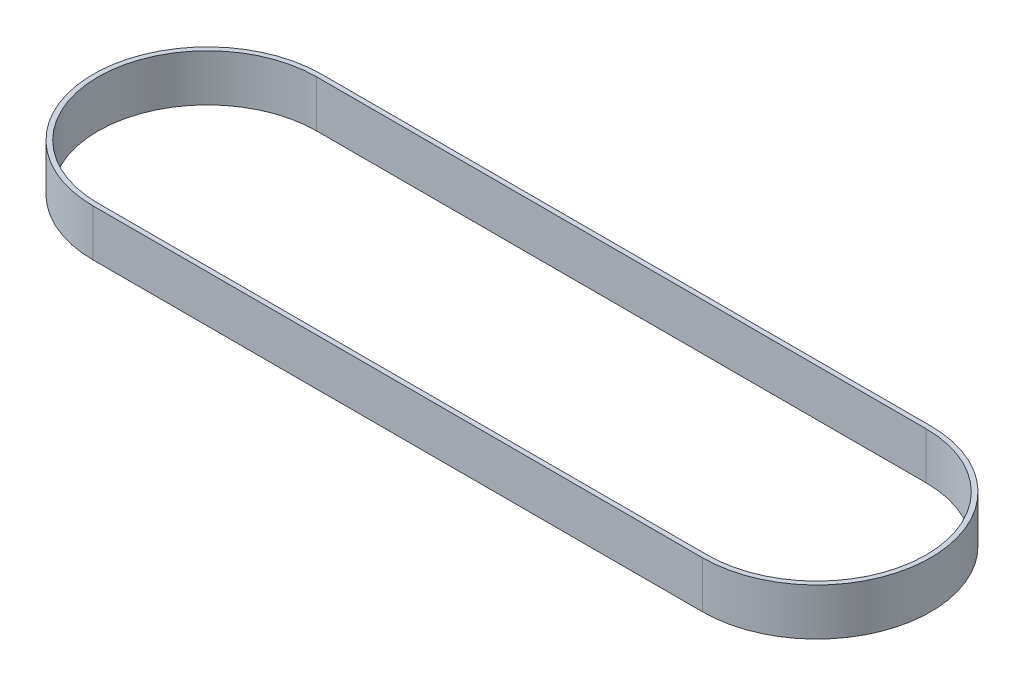
ISO-10303-21;
HEADER;
FILE_DESCRIPTION(('STEP AP214'),'2;1');
FILE_NAME('part.step','',(''),(''),'','','');
FILE_SCHEMA(('AUTOMOTIVE_DESIGN { 1 0 10303 214 1 1 1 1 }'));
ENDSEC;
DATA;
#1=APPLICATION_CONTEXT('core data for automotive mechanical design processes');
#2=APPLICATION_PROTOCOL_DEFINITION('international standard','automotive_design',2000,#1);
#3=PRODUCT_CONTEXT('',#1,'mechanical');
#4=PRODUCT('Part','Part','',(#3));
#5=PRODUCT_RELATED_PRODUCT_CATEGORY('part','',(#4));
#6=PRODUCT_DEFINITION_FORMATION('','',#4);
#7=PRODUCT_DEFINITION_CONTEXT('part definition',#1,'design');
#8=PRODUCT_DEFINITION('design','',#6,#7);
#9=PRODUCT_DEFINITION_SHAPE('','',#8);
#10=(LENGTH_UNIT() NAMED_UNIT(*) SI_UNIT(.MILLI.,.METRE.));
#11=(NAMED_UNIT(*) PLANE_ANGLE_UNIT() SI_UNIT($,.RADIAN.));
#12=(NAMED_UNIT(*) SI_UNIT($,.STERADIAN.) SOLID_ANGLE_UNIT());
#13=UNCERTAINTY_MEASURE_WITH_UNIT(LENGTH_MEASURE(1.E-05),#10,'distance_accuracy_value','');
#14=(GEOMETRIC_REPRESENTATION_CONTEXT(3) GLOBAL_UNCERTAINTY_ASSIGNED_CONTEXT((#13)) GLOBAL_UNIT_ASSIGNED_CONTEXT((#10,
#11,#12)) REPRESENTATION_CONTEXT('',''));
#15=CARTESIAN_POINT('',(0.,0.,0.));
#16=DIRECTION('',(0.,0.,1.));
#17=DIRECTION('',(1.,0.,0.));
#18=AXIS2_PLACEMENT_3D('',#15,#16,#17);
#19=CARTESIAN_POINT('',(0.,15.,0.));
#20=DIRECTION('',(0.,1.,0.));
#21=DIRECTION('',(0.,0.,1.));
#22=AXIS2_PLACEMENT_3D('',#19,#20,#21);
#23=PLANE('',#22);
#24=CARTESIAN_POINT('',(0.,15.,0.));
#25=DIRECTION('',(0.,1.,0.));
#26=DIRECTION('',(0.,0.,1.));
#27=AXIS2_PLACEMENT_3D('',#24,#25,#26);
#28=CIRCLE('',#27,36.5379);
#29=CARTESIAN_POINT('',(0.,15.,-36.5379));
#30=VERTEX_POINT('',#29);
#31=CARTESIAN_POINT('',(0.,15.,36.5379));
#32=VERTEX_POINT('',#31);
#33=EDGE_CURVE('E153',#30,#32,#28,.T.);
#34=ORIENTED_EDGE('',*,*,#33,.T.);
#35=DIRECTION('',(1.,0.,0.));
#36=VECTOR('',#35,1.);
#37=CARTESIAN_POINT('',(0.,15.,36.5379));
#38=LINE('',#37,#36);
#39=CARTESIAN_POINT('',(195.0466,15.,36.5379));
#40=VERTEX_POINT('',#39);
#41=EDGE_CURVE('E157',#32,#40,#38,.T.);
#42=ORIENTED_EDGE('',*,*,#41,.T.);
#43=CARTESIAN_POINT('',(195.0466,15.,0.));
#44=DIRECTION('',(0.,1.,0.));
#45=DIRECTION('',(0.,0.,1.));
#46=AXIS2_PLACEMENT_3D('',#43,#44,#45);
#47=CIRCLE('',#46,36.5379);
#48=CARTESIAN_POINT('',(195.0466,15.,-36.5379));
#49=VERTEX_POINT('',#48);
#50=EDGE_CURVE('E161',#40,#49,#47,.T.);
#51=ORIENTED_EDGE('',*,*,#50,.T.);
#52=DIRECTION('',(-1.,0.,0.));
#53=VECTOR('',#52,1.);
#54=CARTESIAN_POINT('',(0.,15.,-36.5379));
#55=LINE('',#54,#53);
#56=EDGE_CURVE('E164',#49,#30,#55,.T.);
#57=ORIENTED_EDGE('',*,*,#56,.T.);
#58=EDGE_LOOP('',(#34,#42,#51,#57));
#59=FACE_BOUND('',#58,.T.);
#60=DIRECTION('',(1.,0.,0.));
#61=VECTOR('',#60,1.);
#62=CARTESIAN_POINT('',(0.,15.,35.0139));
#63=LINE('',#62,#61);
#64=CARTESIAN_POINT('',(0.,15.,35.0139));
#65=VERTEX_POINT('',#64);
#66=CARTESIAN_POINT('',(195.0466,15.,35.0139));
#67=VERTEX_POINT('',#66);
#68=EDGE_CURVE('E114',#65,#67,#63,.T.);
#69=ORIENTED_EDGE('',*,*,#68,.F.);
#70=CARTESIAN_POINT('',(0.,15.,0.));
#71=DIRECTION('',(0.,1.,0.));
#72=DIRECTION('',(0.,0.,1.));
#73=AXIS2_PLACEMENT_3D('',#70,#71,#72);
#74=CIRCLE('',#73,35.0139);
#75=CARTESIAN_POINT('',(0.,15.,-35.0139));
#76=VERTEX_POINT('',#75);
#77=EDGE_CURVE('E105',#76,#65,#74,.T.);
#78=ORIENTED_EDGE('',*,*,#77,.F.);
#79=DIRECTION('',(-1.,0.,0.));
#80=VECTOR('',#79,1.);
#81=CARTESIAN_POINT('',(0.,15.,-35.0139));
#82=LINE('',#81,#80);
#83=CARTESIAN_POINT('',(195.0466,15.,-35.0139));
#84=VERTEX_POINT('',#83);
#85=EDGE_CURVE('E131',#84,#76,#82,.T.);
#86=ORIENTED_EDGE('',*,*,#85,.F.);
#87=CARTESIAN_POINT('',(195.0466,15.,0.));
#88=DIRECTION('',(0.,1.,0.));
#89=DIRECTION('',(0.,0.,1.));
#90=AXIS2_PLACEMENT_3D('',#87,#88,#89);
#91=CIRCLE('',#90,35.0139);
#92=EDGE_CURVE('E127',#67,#84,#91,.T.);
#93=ORIENTED_EDGE('',*,*,#92,.F.);
#94=EDGE_LOOP('',(#69,#78,#86,#93));
#95=FACE_BOUND('',#94,.T.);
#96=ADVANCED_FACE('F39',(#59,#95),#23,.T.);
#97=CARTESIAN_POINT('',(0.,0.,0.));
#98=DIRECTION('',(0.,1.,0.));
#99=DIRECTION('',(0.,0.,1.));
#100=AXIS2_PLACEMENT_3D('',#97,#98,#99);
#101=PLANE('',#100);
#102=CARTESIAN_POINT('',(0.,0.,0.));
#103=DIRECTION('',(0.,1.,0.));
#104=DIRECTION('',(0.,0.,1.));
#105=AXIS2_PLACEMENT_3D('',#102,#103,#104);
#106=CIRCLE('',#105,36.5379);
#107=CARTESIAN_POINT('',(0.,0.,-36.5379));
#108=VERTEX_POINT('',#107);
#109=CARTESIAN_POINT('',(0.,0.,36.5379));
#110=VERTEX_POINT('',#109);
#111=EDGE_CURVE('E123',#108,#110,#106,.T.);
#112=ORIENTED_EDGE('',*,*,#111,.F.);
#113=DIRECTION('',(-1.,0.,0.));
#114=VECTOR('',#113,1.);
#115=CARTESIAN_POINT('',(0.,0.,-36.5379));
#116=LINE('',#115,#114);
#117=CARTESIAN_POINT('',(195.0466,0.,-36.5379));
#118=VERTEX_POINT('',#117);
#119=EDGE_CURVE('E158',#118,#108,#116,.T.);
#120=ORIENTED_EDGE('',*,*,#119,.F.);
#121=CARTESIAN_POINT('',(195.0466,0.,0.));
#122=DIRECTION('',(0.,1.,0.));
#123=DIRECTION('',(0.,0.,1.));
#124=AXIS2_PLACEMENT_3D('',#121,#122,#123);
#125=CIRCLE('',#124,36.5379);
#126=CARTESIAN_POINT('',(195.0466,0.,36.5379));
#127=VERTEX_POINT('',#126);
#128=EDGE_CURVE('E174',#127,#118,#125,.T.);
#129=ORIENTED_EDGE('',*,*,#128,.F.);
#130=DIRECTION('',(1.,0.,0.));
#131=VECTOR('',#130,1.);
#132=CARTESIAN_POINT('',(0.,0.,36.5379));
#133=LINE('',#132,#131);
#134=EDGE_CURVE('E171',#110,#127,#133,.T.);
#135=ORIENTED_EDGE('',*,*,#134,.F.);
#136=EDGE_LOOP('',(#112,#120,#129,#135));
#137=FACE_BOUND('',#136,.T.);
#138=CARTESIAN_POINT('',(0.,0.,0.));
#139=DIRECTION('',(0.,1.,0.));
#140=DIRECTION('',(0.,0.,1.));
#141=AXIS2_PLACEMENT_3D('',#138,#139,#140);
#142=CIRCLE('',#141,35.0139);
#143=CARTESIAN_POINT('',(0.,0.,-35.0139));
#144=VERTEX_POINT('',#143);
#145=CARTESIAN_POINT('',(0.,0.,35.0139));
#146=VERTEX_POINT('',#145);
#147=EDGE_CURVE('E63',#144,#146,#142,.T.);
#148=ORIENTED_EDGE('',*,*,#147,.T.);
#149=DIRECTION('',(1.,0.,0.));
#150=VECTOR('',#149,1.);
#151=CARTESIAN_POINT('',(0.,0.,35.0139));
#152=LINE('',#151,#150);
#153=CARTESIAN_POINT('',(195.0466,0.,35.0139));
#154=VERTEX_POINT('',#153);
#155=EDGE_CURVE('E121',#146,#154,#152,.T.);
#156=ORIENTED_EDGE('',*,*,#155,.T.);
#157=CARTESIAN_POINT('',(195.0466,0.,0.));
#158=DIRECTION('',(0.,1.,0.));
#159=DIRECTION('',(0.,0.,1.));
#160=AXIS2_PLACEMENT_3D('',#157,#158,#159);
#161=CIRCLE('',#160,35.0139);
#162=CARTESIAN_POINT('',(195.0466,0.,-35.0139));
#163=VERTEX_POINT('',#162);
#164=EDGE_CURVE('E140',#154,#163,#161,.T.);
#165=ORIENTED_EDGE('',*,*,#164,.T.);
#166=DIRECTION('',(-1.,0.,0.));
#167=VECTOR('',#166,1.);
#168=CARTESIAN_POINT('',(0.,0.,-35.0139));
#169=LINE('',#168,#167);
#170=EDGE_CURVE('E115',#163,#144,#169,.T.);
#171=ORIENTED_EDGE('',*,*,#170,.T.);
#172=EDGE_LOOP('',(#148,#156,#165,#171));
#173=FACE_BOUND('',#172,.T.);
#174=ADVANCED_FACE('F197',(#137,#173),#101,.F.);
#175=CARTESIAN_POINT('',(0.,15.,0.));
#176=DIRECTION('',(0.,-1.,0.));
#177=DIRECTION('',(0.,0.,-1.));
#178=AXIS2_PLACEMENT_3D('',#175,#176,#177);
#179=CYLINDRICAL_SURFACE('',#178,36.5379);
#180=ORIENTED_EDGE('',*,*,#111,.T.);
#181=DIRECTION('',(0.,-1.,0.));
#182=VECTOR('',#181,1.);
#183=CARTESIAN_POINT('',(0.,15.,36.5379));
#184=LINE('',#183,#182);
#185=EDGE_CURVE('E11',#32,#110,#184,.T.);
#186=ORIENTED_EDGE('',*,*,#185,.F.);
#187=ORIENTED_EDGE('',*,*,#33,.F.);
#188=DIRECTION('',(0.,-1.,0.));
#189=VECTOR('',#188,1.);
#190=CARTESIAN_POINT('',(0.,15.,-36.5379));
#191=LINE('',#190,#189);
#192=EDGE_CURVE('E167',#30,#108,#191,.T.);
#193=ORIENTED_EDGE('',*,*,#192,.T.);
#194=EDGE_LOOP('',(#180,#186,#187,#193));
#195=FACE_BOUND('',#194,.T.);
#196=ADVANCED_FACE('F41',(#195),#179,.T.);
#197=CARTESIAN_POINT('',(0.,15.,36.5379));
#198=DIRECTION('',(0.,0.,-1.));
#199=DIRECTION('',(-1.,0.,0.));
#200=AXIS2_PLACEMENT_3D('',#197,#198,#199);
#201=PLANE('',#200);
#202=ORIENTED_EDGE('',*,*,#134,.T.);
#203=DIRECTION('',(0.,-1.,0.));
#204=VECTOR('',#203,1.);
#205=CARTESIAN_POINT('',(195.0466,15.,36.5379));
#206=LINE('',#205,#204);
#207=EDGE_CURVE('E48',#40,#127,#206,.T.);
#208=ORIENTED_EDGE('',*,*,#207,.F.);
#209=ORIENTED_EDGE('',*,*,#41,.F.);
#210=ORIENTED_EDGE('',*,*,#185,.T.);
#211=EDGE_LOOP('',(#202,#208,#209,#210));
#212=FACE_BOUND('',#211,.T.);
#213=ADVANCED_FACE('F207',(#212),#201,.F.);
#214=CARTESIAN_POINT('',(195.0466,15.,0.));
#215=DIRECTION('',(0.,-1.,0.));
#216=DIRECTION('',(0.,0.,-1.));
#217=AXIS2_PLACEMENT_3D('',#214,#215,#216);
#218=CYLINDRICAL_SURFACE('',#217,36.5379);
#219=ORIENTED_EDGE('',*,*,#128,.T.);
#220=DIRECTION('',(0.,-1.,0.));
#221=VECTOR('',#220,1.);
#222=CARTESIAN_POINT('',(195.0466,15.,-36.5379));
#223=LINE('',#222,#221);
#224=EDGE_CURVE('E182',#49,#118,#223,.T.);
#225=ORIENTED_EDGE('',*,*,#224,.F.);
#226=ORIENTED_EDGE('',*,*,#50,.F.);
#227=ORIENTED_EDGE('',*,*,#207,.T.);
#228=EDGE_LOOP('',(#219,#225,#226,#227));
#229=FACE_BOUND('',#228,.T.);
#230=ADVANCED_FACE('F191',(#229),#218,.T.);
#231=CARTESIAN_POINT('',(0.,15.,-36.5379));
#232=DIRECTION('',(0.,0.,1.));
#233=DIRECTION('',(1.,0.,0.));
#234=AXIS2_PLACEMENT_3D('',#231,#232,#233);
#235=PLANE('',#234);
#236=ORIENTED_EDGE('',*,*,#119,.T.);
#237=ORIENTED_EDGE('',*,*,#192,.F.);
#238=ORIENTED_EDGE('',*,*,#56,.F.);
#239=ORIENTED_EDGE('',*,*,#224,.T.);
#240=EDGE_LOOP('',(#236,#237,#238,#239));
#241=FACE_BOUND('',#240,.T.);
#242=ADVANCED_FACE('F201',(#241),#235,.F.);
#243=CARTESIAN_POINT('',(0.,15.,0.));
#244=DIRECTION('',(0.,-1.,0.));
#245=DIRECTION('',(0.,0.,-1.));
#246=AXIS2_PLACEMENT_3D('',#243,#244,#245);
#247=CYLINDRICAL_SURFACE('',#246,35.0139);
#248=ORIENTED_EDGE('',*,*,#147,.F.);
#249=DIRECTION('',(0.,-1.,0.));
#250=VECTOR('',#249,1.);
#251=CARTESIAN_POINT('',(0.,15.,-35.0139));
#252=LINE('',#251,#250);
#253=EDGE_CURVE('E109',#76,#144,#252,.T.);
#254=ORIENTED_EDGE('',*,*,#253,.F.);
#255=ORIENTED_EDGE('',*,*,#77,.T.);
#256=DIRECTION('',(0.,-1.,0.));
#257=VECTOR('',#256,1.);
#258=CARTESIAN_POINT('',(0.,15.,35.0139));
#259=LINE('',#258,#257);
#260=EDGE_CURVE('E108',#65,#146,#259,.T.);
#261=ORIENTED_EDGE('',*,*,#260,.T.);
#262=EDGE_LOOP('',(#248,#254,#255,#261));
#263=FACE_BOUND('',#262,.T.);
#264=ADVANCED_FACE('F107',(#263),#247,.F.);
#265=CARTESIAN_POINT('',(0.,15.,35.0139));
#266=DIRECTION('',(0.,0.,-1.));
#267=DIRECTION('',(-1.,0.,0.));
#268=AXIS2_PLACEMENT_3D('',#265,#266,#267);
#269=PLANE('',#268);
#270=ORIENTED_EDGE('',*,*,#155,.F.);
#271=ORIENTED_EDGE('',*,*,#260,.F.);
#272=ORIENTED_EDGE('',*,*,#68,.T.);
#273=DIRECTION('',(0.,-1.,0.));
#274=VECTOR('',#273,1.);
#275=CARTESIAN_POINT('',(195.0466,15.,35.0139));
#276=LINE('',#275,#274);
#277=EDGE_CURVE('E124',#67,#154,#276,.T.);
#278=ORIENTED_EDGE('',*,*,#277,.T.);
#279=EDGE_LOOP('',(#270,#271,#272,#278));
#280=FACE_BOUND('',#279,.T.);
#281=ADVANCED_FACE('F118',(#280),#269,.T.);
#282=CARTESIAN_POINT('',(195.0466,15.,0.));
#283=DIRECTION('',(0.,-1.,0.));
#284=DIRECTION('',(0.,0.,-1.));
#285=AXIS2_PLACEMENT_3D('',#282,#283,#284);
#286=CYLINDRICAL_SURFACE('',#285,35.0139);
#287=ORIENTED_EDGE('',*,*,#164,.F.);
#288=ORIENTED_EDGE('',*,*,#277,.F.);
#289=ORIENTED_EDGE('',*,*,#92,.T.);
#290=DIRECTION('',(0.,-1.,0.));
#291=VECTOR('',#290,1.);
#292=CARTESIAN_POINT('',(195.0466,15.,-35.0139));
#293=LINE('',#292,#291);
#294=EDGE_CURVE('E55',#84,#163,#293,.T.);
#295=ORIENTED_EDGE('',*,*,#294,.T.);
#296=EDGE_LOOP('',(#287,#288,#289,#295));
#297=FACE_BOUND('',#296,.T.);
#298=ADVANCED_FACE('F230',(#297),#286,.F.);
#299=CARTESIAN_POINT('',(0.,15.,-35.0139));
#300=DIRECTION('',(0.,0.,1.));
#301=DIRECTION('',(1.,0.,0.));
#302=AXIS2_PLACEMENT_3D('',#299,#300,#301);
#303=PLANE('',#302);
#304=ORIENTED_EDGE('',*,*,#170,.F.);
#305=ORIENTED_EDGE('',*,*,#294,.F.);
#306=ORIENTED_EDGE('',*,*,#85,.T.);
#307=ORIENTED_EDGE('',*,*,#253,.T.);
#308=EDGE_LOOP('',(#304,#305,#306,#307));
#309=FACE_BOUND('',#308,.T.);
#310=ADVANCED_FACE('F234',(#309),#303,.T.);
#311=CLOSED_SHELL('',(#96,#174,#196,#213,#230,#242,#264,#281,#298,#310));
#312=MANIFOLD_SOLID_BREP('B2',#311);
#313=ADVANCED_BREP_SHAPE_REPRESENTATION('',(#18,#312),#14);
#314=SHAPE_DEFINITION_REPRESENTATION(#9,#313);
ENDSEC;
END-ISO-10303-21;
